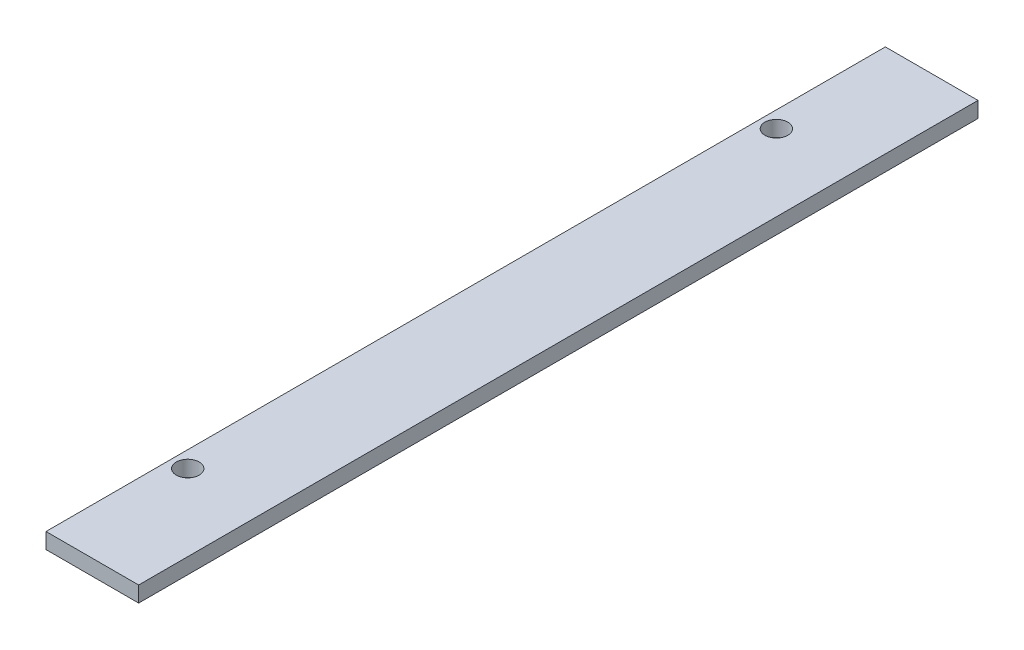
ISO-10303-21;
HEADER;
FILE_DESCRIPTION(('STEP AP214'),'2;1');
FILE_NAME('part.step','',(''),(''),'','','');
FILE_SCHEMA(('AUTOMOTIVE_DESIGN { 1 0 10303 214 1 1 1 1 }'));
ENDSEC;
DATA;
#1=APPLICATION_CONTEXT('core data for automotive mechanical design processes');
#2=APPLICATION_PROTOCOL_DEFINITION('international standard','automotive_design',2000,#1);
#3=PRODUCT_CONTEXT('',#1,'mechanical');
#4=PRODUCT('Part','Part','',(#3));
#5=PRODUCT_RELATED_PRODUCT_CATEGORY('part','',(#4));
#6=PRODUCT_DEFINITION_FORMATION('','',#4);
#7=PRODUCT_DEFINITION_CONTEXT('part definition',#1,'design');
#8=PRODUCT_DEFINITION('design','',#6,#7);
#9=PRODUCT_DEFINITION_SHAPE('','',#8);
#10=(LENGTH_UNIT() NAMED_UNIT(*) SI_UNIT(.MILLI.,.METRE.));
#11=(NAMED_UNIT(*) PLANE_ANGLE_UNIT() SI_UNIT($,.RADIAN.));
#12=(NAMED_UNIT(*) SI_UNIT($,.STERADIAN.) SOLID_ANGLE_UNIT());
#13=UNCERTAINTY_MEASURE_WITH_UNIT(LENGTH_MEASURE(1.E-05),#10,'distance_accuracy_value','');
#14=(GEOMETRIC_REPRESENTATION_CONTEXT(3) GLOBAL_UNCERTAINTY_ASSIGNED_CONTEXT((#13)) GLOBAL_UNIT_ASSIGNED_CONTEXT((#10,
#11,#12)) REPRESENTATION_CONTEXT('',''));
#15=CARTESIAN_POINT('',(0.,0.,0.));
#16=DIRECTION('',(0.,0.,1.));
#17=DIRECTION('',(1.,0.,0.));
#18=AXIS2_PLACEMENT_3D('',#15,#16,#17);
#19=CARTESIAN_POINT('',(0.,1.44,0.));
#20=DIRECTION('',(1.,0.,0.));
#21=DIRECTION('',(0.,0.,-1.));
#22=AXIS2_PLACEMENT_3D('',#19,#20,#21);
#23=PLANE('',#22);
#24=DIRECTION('',(0.,0.,1.));
#25=VECTOR('',#24,1.);
#26=CARTESIAN_POINT('',(0.,0.,0.));
#27=LINE('',#26,#25);
#28=CARTESIAN_POINT('',(0.,0.,0.));
#29=VERTEX_POINT('',#28);
#30=CARTESIAN_POINT('',(0.,0.,77.));
#31=VERTEX_POINT('',#30);
#32=EDGE_CURVE('E106',#29,#31,#27,.T.);
#33=ORIENTED_EDGE('',*,*,#32,.T.);
#34=DIRECTION('',(0.,-1.,0.));
#35=VECTOR('',#34,1.);
#36=CARTESIAN_POINT('',(0.,1.44,77.));
#37=LINE('',#36,#35);
#38=CARTESIAN_POINT('',(0.,1.44,77.));
#39=VERTEX_POINT('',#38);
#40=EDGE_CURVE('E11',#39,#31,#37,.T.);
#41=ORIENTED_EDGE('',*,*,#40,.F.);
#42=DIRECTION('',(0.,0.,1.));
#43=VECTOR('',#42,1.);
#44=CARTESIAN_POINT('',(0.,1.44,0.));
#45=LINE('',#44,#43);
#46=CARTESIAN_POINT('',(0.,1.44,0.));
#47=VERTEX_POINT('',#46);
#48=EDGE_CURVE('E90',#47,#39,#45,.T.);
#49=ORIENTED_EDGE('',*,*,#48,.F.);
#50=DIRECTION('',(0.,-1.,0.));
#51=VECTOR('',#50,1.);
#52=CARTESIAN_POINT('',(0.,1.44,0.));
#53=LINE('',#52,#51);
#54=EDGE_CURVE('E102',#47,#29,#53,.T.);
#55=ORIENTED_EDGE('',*,*,#54,.T.);
#56=EDGE_LOOP('',(#33,#41,#49,#55));
#57=FACE_BOUND('',#56,.T.);
#58=ADVANCED_FACE('F38',(#57),#23,.F.);
#59=CARTESIAN_POINT('',(0.,1.44,77.));
#60=DIRECTION('',(0.,0.,-1.));
#61=DIRECTION('',(-1.,0.,0.));
#62=AXIS2_PLACEMENT_3D('',#59,#60,#61);
#63=PLANE('',#62);
#64=DIRECTION('',(1.,0.,0.));
#65=VECTOR('',#64,1.);
#66=CARTESIAN_POINT('',(0.,0.,77.));
#67=LINE('',#66,#65);
#68=CARTESIAN_POINT('',(8.50000000000001,0.,77.));
#69=VERTEX_POINT('',#68);
#70=EDGE_CURVE('E95',#31,#69,#67,.T.);
#71=ORIENTED_EDGE('',*,*,#70,.T.);
#72=DIRECTION('',(0.,-1.,0.));
#73=VECTOR('',#72,1.);
#74=CARTESIAN_POINT('',(8.50000000000001,1.44,77.));
#75=LINE('',#74,#73);
#76=CARTESIAN_POINT('',(8.50000000000001,1.44,77.));
#77=VERTEX_POINT('',#76);
#78=EDGE_CURVE('E47',#77,#69,#75,.T.);
#79=ORIENTED_EDGE('',*,*,#78,.F.);
#80=DIRECTION('',(1.,0.,0.));
#81=VECTOR('',#80,1.);
#82=CARTESIAN_POINT('',(0.,1.44,77.));
#83=LINE('',#82,#81);
#84=EDGE_CURVE('E85',#39,#77,#83,.T.);
#85=ORIENTED_EDGE('',*,*,#84,.F.);
#86=ORIENTED_EDGE('',*,*,#40,.T.);
#87=EDGE_LOOP('',(#71,#79,#85,#86));
#88=FACE_BOUND('',#87,.T.);
#89=ADVANCED_FACE('F94',(#88),#63,.F.);
#90=CARTESIAN_POINT('',(8.5,1.44,0.));
#91=DIRECTION('',(-1.,0.,0.));
#92=DIRECTION('',(0.,0.,1.));
#93=AXIS2_PLACEMENT_3D('',#90,#91,#92);
#94=PLANE('',#93);
#95=DIRECTION('',(0.,0.,-1.));
#96=VECTOR('',#95,1.);
#97=CARTESIAN_POINT('',(8.5,0.,0.));
#98=LINE('',#97,#96);
#99=CARTESIAN_POINT('',(8.5,0.,0.));
#100=VERTEX_POINT('',#99);
#101=EDGE_CURVE('E72',#69,#100,#98,.T.);
#102=ORIENTED_EDGE('',*,*,#101,.T.);
#103=DIRECTION('',(0.,-1.,0.));
#104=VECTOR('',#103,1.);
#105=CARTESIAN_POINT('',(8.5,1.44,0.));
#106=LINE('',#105,#104);
#107=CARTESIAN_POINT('',(8.5,1.44,0.));
#108=VERTEX_POINT('',#107);
#109=EDGE_CURVE('E97',#108,#100,#106,.T.);
#110=ORIENTED_EDGE('',*,*,#109,.F.);
#111=DIRECTION('',(0.,0.,-1.));
#112=VECTOR('',#111,1.);
#113=CARTESIAN_POINT('',(8.5,1.44,0.));
#114=LINE('',#113,#112);
#115=EDGE_CURVE('E88',#77,#108,#114,.T.);
#116=ORIENTED_EDGE('',*,*,#115,.F.);
#117=ORIENTED_EDGE('',*,*,#78,.T.);
#118=EDGE_LOOP('',(#102,#110,#116,#117));
#119=FACE_BOUND('',#118,.T.);
#120=ADVANCED_FACE('F98',(#119),#94,.F.);
#121=CARTESIAN_POINT('',(0.,1.44,0.));
#122=DIRECTION('',(0.,0.,1.));
#123=DIRECTION('',(1.,0.,0.));
#124=AXIS2_PLACEMENT_3D('',#121,#122,#123);
#125=PLANE('',#124);
#126=DIRECTION('',(-1.,0.,0.));
#127=VECTOR('',#126,1.);
#128=CARTESIAN_POINT('',(0.,0.,0.));
#129=LINE('',#128,#127);
#130=EDGE_CURVE('E78',#100,#29,#129,.T.);
#131=ORIENTED_EDGE('',*,*,#130,.T.);
#132=ORIENTED_EDGE('',*,*,#54,.F.);
#133=DIRECTION('',(-1.,0.,0.));
#134=VECTOR('',#133,1.);
#135=CARTESIAN_POINT('',(0.,1.44,0.));
#136=LINE('',#135,#134);
#137=EDGE_CURVE('E55',#108,#47,#136,.T.);
#138=ORIENTED_EDGE('',*,*,#137,.F.);
#139=ORIENTED_EDGE('',*,*,#109,.T.);
#140=EDGE_LOOP('',(#131,#132,#138,#139));
#141=FACE_BOUND('',#140,.T.);
#142=ADVANCED_FACE('F120',(#141),#125,.F.);
#143=CARTESIAN_POINT('',(0.,1.44,0.));
#144=DIRECTION('',(0.,1.,0.));
#145=DIRECTION('',(0.,0.,1.));
#146=AXIS2_PLACEMENT_3D('',#143,#144,#145);
#147=PLANE('',#146);
#148=CARTESIAN_POINT('',(1.5,1.44,65.5));
#149=DIRECTION('',(0.,1.,0.));
#150=DIRECTION('',(0.,0.,1.));
#151=AXIS2_PLACEMENT_3D('',#148,#149,#150);
#152=CIRCLE('',#151,1.05);
#153=CARTESIAN_POINT('',(1.5,1.44,66.55));
#154=VERTEX_POINT('',#153);
#155=EDGE_CURVE('E135',#154,#154,#152,.T.);
#156=ORIENTED_EDGE('',*,*,#155,.F.);
#157=EDGE_LOOP('',(#156));
#158=FACE_BOUND('',#157,.T.);
#159=CARTESIAN_POINT('',(1.5,1.44,11.5));
#160=DIRECTION('',(0.,1.,0.));
#161=DIRECTION('',(0.,0.,1.));
#162=AXIS2_PLACEMENT_3D('',#159,#160,#161);
#163=CIRCLE('',#162,1.05);
#164=CARTESIAN_POINT('',(1.5,1.44,12.55));
#165=VERTEX_POINT('',#164);
#166=EDGE_CURVE('E127',#165,#165,#163,.T.);
#167=ORIENTED_EDGE('',*,*,#166,.F.);
#168=EDGE_LOOP('',(#167));
#169=FACE_BOUND('',#168,.T.);
#170=ORIENTED_EDGE('',*,*,#48,.T.);
#171=ORIENTED_EDGE('',*,*,#84,.T.);
#172=ORIENTED_EDGE('',*,*,#115,.T.);
#173=ORIENTED_EDGE('',*,*,#137,.T.);
#174=EDGE_LOOP('',(#170,#171,#172,#173));
#175=FACE_BOUND('',#174,.T.);
#176=ADVANCED_FACE('F86',(#158,#169,#175),#147,.T.);
#177=CARTESIAN_POINT('',(0.,0.,0.));
#178=DIRECTION('',(0.,1.,0.));
#179=DIRECTION('',(0.,0.,1.));
#180=AXIS2_PLACEMENT_3D('',#177,#178,#179);
#181=PLANE('',#180);
#182=CARTESIAN_POINT('',(1.5,0.,65.5));
#183=DIRECTION('',(0.,1.,0.));
#184=DIRECTION('',(0.,0.,1.));
#185=AXIS2_PLACEMENT_3D('',#182,#183,#184);
#186=CIRCLE('',#185,1.05);
#187=CARTESIAN_POINT('',(1.5,0.,66.55));
#188=VERTEX_POINT('',#187);
#189=EDGE_CURVE('E110',#188,#188,#186,.T.);
#190=ORIENTED_EDGE('',*,*,#189,.T.);
#191=EDGE_LOOP('',(#190));
#192=FACE_BOUND('',#191,.T.);
#193=CARTESIAN_POINT('',(1.5,0.,11.5));
#194=DIRECTION('',(0.,1.,0.));
#195=DIRECTION('',(0.,0.,1.));
#196=AXIS2_PLACEMENT_3D('',#193,#194,#195);
#197=CIRCLE('',#196,1.05);
#198=CARTESIAN_POINT('',(1.5,0.,12.55));
#199=VERTEX_POINT('',#198);
#200=EDGE_CURVE('E131',#199,#199,#197,.T.);
#201=ORIENTED_EDGE('',*,*,#200,.T.);
#202=EDGE_LOOP('',(#201));
#203=FACE_BOUND('',#202,.T.);
#204=ORIENTED_EDGE('',*,*,#32,.F.);
#205=ORIENTED_EDGE('',*,*,#130,.F.);
#206=ORIENTED_EDGE('',*,*,#101,.F.);
#207=ORIENTED_EDGE('',*,*,#70,.F.);
#208=EDGE_LOOP('',(#204,#205,#206,#207));
#209=FACE_BOUND('',#208,.T.);
#210=ADVANCED_FACE('F123',(#192,#203,#209),#181,.F.);
#211=CARTESIAN_POINT('',(1.5,0.,11.5));
#212=DIRECTION('',(0.,1.,0.));
#213=DIRECTION('',(0.,0.,1.));
#214=AXIS2_PLACEMENT_3D('',#211,#212,#213);
#215=CYLINDRICAL_SURFACE('',#214,1.05);
#216=CARTESIAN_POINT('',(1.5,0.,12.55));
#217=CARTESIAN_POINT('',(1.5,0.015,12.55));
#218=CARTESIAN_POINT('',(1.5,0.03,12.55));
#219=CARTESIAN_POINT('',(1.5,0.06,12.55));
#220=CARTESIAN_POINT('',(1.5,0.075,12.55));
#221=CARTESIAN_POINT('',(1.5,0.105,12.55));
#222=CARTESIAN_POINT('',(1.5,0.12,12.55));
#223=CARTESIAN_POINT('',(1.5,0.15,12.55));
#224=CARTESIAN_POINT('',(1.5,0.165,12.55));
#225=CARTESIAN_POINT('',(1.5,0.195,12.55));
#226=CARTESIAN_POINT('',(1.5,0.21,12.55));
#227=CARTESIAN_POINT('',(1.5,0.24,12.55));
#228=CARTESIAN_POINT('',(1.5,0.255,12.55));
#229=CARTESIAN_POINT('',(1.5,0.285,12.55));
#230=CARTESIAN_POINT('',(1.5,0.3,12.55));
#231=CARTESIAN_POINT('',(1.5,0.33,12.55));
#232=CARTESIAN_POINT('',(1.5,0.345,12.55));
#233=CARTESIAN_POINT('',(1.5,0.375,12.55));
#234=CARTESIAN_POINT('',(1.5,0.39,12.55));
#235=CARTESIAN_POINT('',(1.5,0.42,12.55));
#236=CARTESIAN_POINT('',(1.5,0.435,12.55));
#237=CARTESIAN_POINT('',(1.5,0.465,12.55));
#238=CARTESIAN_POINT('',(1.5,0.48,12.55));
#239=CARTESIAN_POINT('',(1.5,0.51,12.55));
#240=CARTESIAN_POINT('',(1.5,0.525,12.55));
#241=CARTESIAN_POINT('',(1.5,0.555,12.55));
#242=CARTESIAN_POINT('',(1.5,0.57,12.55));
#243=CARTESIAN_POINT('',(1.5,0.6,12.55));
#244=CARTESIAN_POINT('',(1.5,0.615,12.55));
#245=CARTESIAN_POINT('',(1.5,0.645,12.55));
#246=CARTESIAN_POINT('',(1.5,0.66,12.55));
#247=CARTESIAN_POINT('',(1.5,0.69,12.55));
#248=CARTESIAN_POINT('',(1.5,0.705,12.55));
#249=CARTESIAN_POINT('',(1.5,0.735,12.55));
#250=CARTESIAN_POINT('',(1.5,0.75,12.55));
#251=CARTESIAN_POINT('',(1.5,0.78,12.55));
#252=CARTESIAN_POINT('',(1.5,0.795,12.55));
#253=CARTESIAN_POINT('',(1.5,0.825,12.55));
#254=CARTESIAN_POINT('',(1.5,0.84,12.55));
#255=CARTESIAN_POINT('',(1.5,0.87,12.55));
#256=CARTESIAN_POINT('',(1.5,0.885,12.55));
#257=CARTESIAN_POINT('',(1.5,0.915,12.55));
#258=CARTESIAN_POINT('',(1.5,0.93,12.55));
#259=CARTESIAN_POINT('',(1.5,0.96,12.55));
#260=CARTESIAN_POINT('',(1.5,0.975,12.55));
#261=CARTESIAN_POINT('',(1.5,1.005,12.55));
#262=CARTESIAN_POINT('',(1.5,1.02,12.55));
#263=CARTESIAN_POINT('',(1.5,1.05,12.55));
#264=CARTESIAN_POINT('',(1.5,1.065,12.55));
#265=CARTESIAN_POINT('',(1.5,1.095,12.55));
#266=CARTESIAN_POINT('',(1.5,1.11,12.55));
#267=CARTESIAN_POINT('',(1.5,1.14,12.55));
#268=CARTESIAN_POINT('',(1.5,1.155,12.55));
#269=CARTESIAN_POINT('',(1.5,1.185,12.55));
#270=CARTESIAN_POINT('',(1.5,1.2,12.55));
#271=CARTESIAN_POINT('',(1.5,1.23,12.55));
#272=CARTESIAN_POINT('',(1.5,1.245,12.55));
#273=CARTESIAN_POINT('',(1.5,1.275,12.55));
#274=CARTESIAN_POINT('',(1.5,1.29,12.55));
#275=CARTESIAN_POINT('',(1.5,1.32,12.55));
#276=CARTESIAN_POINT('',(1.5,1.335,12.55));
#277=CARTESIAN_POINT('',(1.5,1.365,12.55));
#278=CARTESIAN_POINT('',(1.5,1.38,12.55));
#279=CARTESIAN_POINT('',(1.5,1.41,12.55));
#280=CARTESIAN_POINT('',(1.5,1.425,12.55));
#281=CARTESIAN_POINT('',(1.5,1.44,12.55));
#282=B_SPLINE_CURVE_WITH_KNOTS('',3,(#216,#217,#218,#219,#220,#221,#222,#223,#224,#225,#226,
#227,#228,#229,#230,#231,#232,#233,#234,#235,#236,#237,#238,#239,#240,#241,#242,#243,#244,#245,
#246,#247,#248,#249,#250,#251,#252,#253,#254,#255,#256,#257,#258,#259,#260,#261,#262,#263,#264,
#265,#266,#267,#268,#269,#270,#271,#272,#273,#274,#275,#276,#277,#278,#279,#280,#281),
.UNSPECIFIED.,.F.,.F.,(4,2,2,2,2,2,2,2,2,2,2,2,2,2,2,2,2,2,2,2,2,2,2,2,2,2,2,2,2,2,2,2,4),(0.,
0.045,0.09,0.135,0.18,0.225,0.27,0.315,0.36,0.405,0.45,0.495,0.54,0.585,0.63,0.675,0.72,0.765,
0.81,0.855,0.9,0.945,0.99,1.035,1.08,1.125,1.17,1.215,1.26,1.305,1.35,1.395,1.44),.UNSPECIFIED.);
#283=EDGE_CURVE('BSEAM148',#199,#165,#282,.T.);
#284=ORIENTED_EDGE('',*,*,#200,.F.);
#285=ORIENTED_EDGE('',*,*,#166,.T.);
#286=ORIENTED_EDGE('',*,*,#283,.T.);
#287=ORIENTED_EDGE('',*,*,#283,.F.);
#288=EDGE_LOOP('',(#284,#286,#285,#287));
#289=FACE_BOUND('',#288,.T.);
#290=ADVANCED_FACE('F148',(#289),#215,.F.);
#291=CARTESIAN_POINT('',(1.5,0.,65.5));
#292=DIRECTION('',(0.,1.,0.));
#293=DIRECTION('',(0.,0.,1.));
#294=AXIS2_PLACEMENT_3D('',#291,#292,#293);
#295=CYLINDRICAL_SURFACE('',#294,1.05);
#296=CARTESIAN_POINT('',(1.5,0.,66.55));
#297=CARTESIAN_POINT('',(1.5,0.015,66.55));
#298=CARTESIAN_POINT('',(1.5,0.03,66.55));
#299=CARTESIAN_POINT('',(1.5,0.06,66.55));
#300=CARTESIAN_POINT('',(1.5,0.075,66.55));
#301=CARTESIAN_POINT('',(1.5,0.105,66.55));
#302=CARTESIAN_POINT('',(1.5,0.12,66.55));
#303=CARTESIAN_POINT('',(1.5,0.15,66.55));
#304=CARTESIAN_POINT('',(1.5,0.165,66.55));
#305=CARTESIAN_POINT('',(1.5,0.195,66.55));
#306=CARTESIAN_POINT('',(1.5,0.21,66.55));
#307=CARTESIAN_POINT('',(1.5,0.24,66.55));
#308=CARTESIAN_POINT('',(1.5,0.255,66.55));
#309=CARTESIAN_POINT('',(1.5,0.285,66.55));
#310=CARTESIAN_POINT('',(1.5,0.3,66.55));
#311=CARTESIAN_POINT('',(1.5,0.33,66.55));
#312=CARTESIAN_POINT('',(1.5,0.345,66.55));
#313=CARTESIAN_POINT('',(1.5,0.375,66.55));
#314=CARTESIAN_POINT('',(1.5,0.39,66.55));
#315=CARTESIAN_POINT('',(1.5,0.42,66.55));
#316=CARTESIAN_POINT('',(1.5,0.435,66.55));
#317=CARTESIAN_POINT('',(1.5,0.465,66.55));
#318=CARTESIAN_POINT('',(1.5,0.48,66.55));
#319=CARTESIAN_POINT('',(1.5,0.51,66.55));
#320=CARTESIAN_POINT('',(1.5,0.525,66.55));
#321=CARTESIAN_POINT('',(1.5,0.555,66.55));
#322=CARTESIAN_POINT('',(1.5,0.57,66.55));
#323=CARTESIAN_POINT('',(1.5,0.6,66.55));
#324=CARTESIAN_POINT('',(1.5,0.615,66.55));
#325=CARTESIAN_POINT('',(1.5,0.645,66.55));
#326=CARTESIAN_POINT('',(1.5,0.66,66.55));
#327=CARTESIAN_POINT('',(1.5,0.69,66.55));
#328=CARTESIAN_POINT('',(1.5,0.705,66.55));
#329=CARTESIAN_POINT('',(1.5,0.735,66.55));
#330=CARTESIAN_POINT('',(1.5,0.75,66.55));
#331=CARTESIAN_POINT('',(1.5,0.78,66.55));
#332=CARTESIAN_POINT('',(1.5,0.795,66.55));
#333=CARTESIAN_POINT('',(1.5,0.825,66.55));
#334=CARTESIAN_POINT('',(1.5,0.84,66.55));
#335=CARTESIAN_POINT('',(1.5,0.87,66.55));
#336=CARTESIAN_POINT('',(1.5,0.885,66.55));
#337=CARTESIAN_POINT('',(1.5,0.915,66.55));
#338=CARTESIAN_POINT('',(1.5,0.93,66.55));
#339=CARTESIAN_POINT('',(1.5,0.96,66.55));
#340=CARTESIAN_POINT('',(1.5,0.975,66.55));
#341=CARTESIAN_POINT('',(1.5,1.005,66.55));
#342=CARTESIAN_POINT('',(1.5,1.02,66.55));
#343=CARTESIAN_POINT('',(1.5,1.05,66.55));
#344=CARTESIAN_POINT('',(1.5,1.065,66.55));
#345=CARTESIAN_POINT('',(1.5,1.095,66.55));
#346=CARTESIAN_POINT('',(1.5,1.11,66.55));
#347=CARTESIAN_POINT('',(1.5,1.14,66.55));
#348=CARTESIAN_POINT('',(1.5,1.155,66.55));
#349=CARTESIAN_POINT('',(1.5,1.185,66.55));
#350=CARTESIAN_POINT('',(1.5,1.2,66.55));
#351=CARTESIAN_POINT('',(1.5,1.23,66.55));
#352=CARTESIAN_POINT('',(1.5,1.245,66.55));
#353=CARTESIAN_POINT('',(1.5,1.275,66.55));
#354=CARTESIAN_POINT('',(1.5,1.29,66.55));
#355=CARTESIAN_POINT('',(1.5,1.32,66.55));
#356=CARTESIAN_POINT('',(1.5,1.335,66.55));
#357=CARTESIAN_POINT('',(1.5,1.365,66.55));
#358=CARTESIAN_POINT('',(1.5,1.38,66.55));
#359=CARTESIAN_POINT('',(1.5,1.41,66.55));
#360=CARTESIAN_POINT('',(1.5,1.425,66.55));
#361=CARTESIAN_POINT('',(1.5,1.44,66.55));
#362=B_SPLINE_CURVE_WITH_KNOTS('',3,(#296,#297,#298,#299,#300,#301,#302,#303,#304,#305,#306,
#307,#308,#309,#310,#311,#312,#313,#314,#315,#316,#317,#318,#319,#320,#321,#322,#323,#324,#325,
#326,#327,#328,#329,#330,#331,#332,#333,#334,#335,#336,#337,#338,#339,#340,#341,#342,#343,#344,
#345,#346,#347,#348,#349,#350,#351,#352,#353,#354,#355,#356,#357,#358,#359,#360,#361),
.UNSPECIFIED.,.F.,.F.,(4,2,2,2,2,2,2,2,2,2,2,2,2,2,2,2,2,2,2,2,2,2,2,2,2,2,2,2,2,2,2,2,4),(0.,
0.045,0.09,0.135,0.18,0.225,0.27,0.315,0.36,0.405,0.45,0.495,0.54,0.585,0.63,0.675,0.72,0.765,
0.81,0.855,0.9,0.945,0.99,1.035,1.08,1.125,1.17,1.215,1.26,1.305,1.35,1.395,1.44),.UNSPECIFIED.);
#363=EDGE_CURVE('BSEAM145',#188,#154,#362,.T.);
#364=ORIENTED_EDGE('',*,*,#189,.F.);
#365=ORIENTED_EDGE('',*,*,#155,.T.);
#366=ORIENTED_EDGE('',*,*,#363,.T.);
#367=ORIENTED_EDGE('',*,*,#363,.F.);
#368=EDGE_LOOP('',(#364,#366,#365,#367));
#369=FACE_BOUND('',#368,.T.);
#370=ADVANCED_FACE('F145',(#369),#295,.F.);
#371=CLOSED_SHELL('',(#58,#89,#120,#142,#176,#210,#290,#370));
#372=MANIFOLD_SOLID_BREP('B2',#371);
#373=ADVANCED_BREP_SHAPE_REPRESENTATION('',(#18,#372),#14);
#374=SHAPE_DEFINITION_REPRESENTATION(#9,#373);
ENDSEC;
END-ISO-10303-21;
